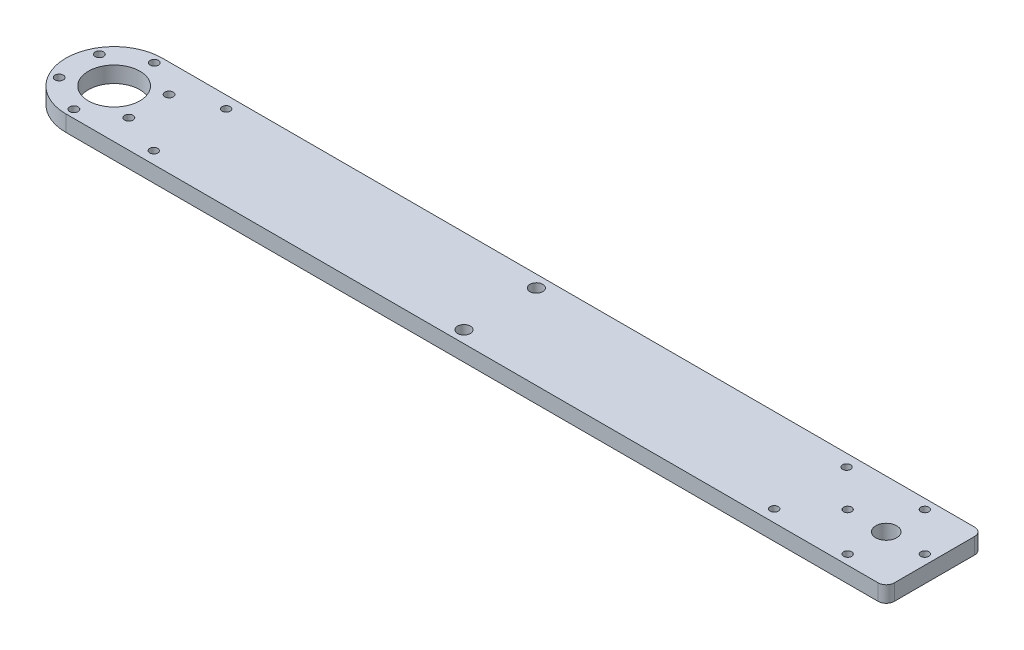
ISO-10303-21;
HEADER;
FILE_DESCRIPTION(('STEP AP214'),'2;1');
FILE_NAME('part.step','',(''),(''),'','','');
FILE_SCHEMA(('AUTOMOTIVE_DESIGN { 1 0 10303 214 1 1 1 1 }'));
ENDSEC;
DATA;
#1=APPLICATION_CONTEXT('core data for automotive mechanical design processes');
#2=APPLICATION_PROTOCOL_DEFINITION('international standard','automotive_design',2000,#1);
#3=PRODUCT_CONTEXT('',#1,'mechanical');
#4=PRODUCT('Part','Part','',(#3));
#5=PRODUCT_RELATED_PRODUCT_CATEGORY('part','',(#4));
#6=PRODUCT_DEFINITION_FORMATION('','',#4);
#7=PRODUCT_DEFINITION_CONTEXT('part definition',#1,'design');
#8=PRODUCT_DEFINITION('design','',#6,#7);
#9=PRODUCT_DEFINITION_SHAPE('','',#8);
#10=(LENGTH_UNIT() NAMED_UNIT(*) SI_UNIT(.MILLI.,.METRE.));
#11=(NAMED_UNIT(*) PLANE_ANGLE_UNIT() SI_UNIT($,.RADIAN.));
#12=(NAMED_UNIT(*) SI_UNIT($,.STERADIAN.) SOLID_ANGLE_UNIT());
#13=UNCERTAINTY_MEASURE_WITH_UNIT(LENGTH_MEASURE(1.E-05),#10,'distance_accuracy_value','');
#14=(GEOMETRIC_REPRESENTATION_CONTEXT(3) GLOBAL_UNCERTAINTY_ASSIGNED_CONTEXT((#13)) GLOBAL_UNIT_ASSIGNED_CONTEXT((#10,
#11,#12)) REPRESENTATION_CONTEXT('',''));
#15=CARTESIAN_POINT('',(0.,0.,0.));
#16=DIRECTION('',(0.,0.,1.));
#17=DIRECTION('',(1.,0.,0.));
#18=AXIS2_PLACEMENT_3D('',#15,#16,#17);
#19=CARTESIAN_POINT('',(-250.,5.,0.));
#20=DIRECTION('',(0.,-1.,0.));
#21=DIRECTION('',(0.,0.,-1.));
#22=AXIS2_PLACEMENT_3D('',#19,#20,#21);
#23=CYLINDRICAL_SURFACE('',#22,30.);
#24=CARTESIAN_POINT('',(-250.,-5.,0.));
#25=DIRECTION('',(0.,1.,0.));
#26=DIRECTION('',(0.,0.,1.));
#27=AXIS2_PLACEMENT_3D('',#24,#25,#26);
#28=CIRCLE('',#27,30.);
#29=CARTESIAN_POINT('',(-250.,-5.,-30.));
#30=VERTEX_POINT('',#29);
#31=CARTESIAN_POINT('',(-250.,-5.,30.));
#32=VERTEX_POINT('',#31);
#33=EDGE_CURVE('E123',#30,#32,#28,.T.);
#34=ORIENTED_EDGE('',*,*,#33,.T.);
#35=DIRECTION('',(0.,-1.,0.));
#36=VECTOR('',#35,1.);
#37=CARTESIAN_POINT('',(-250.,5.,30.));
#38=LINE('',#37,#36);
#39=CARTESIAN_POINT('',(-250.,5.,30.));
#40=VERTEX_POINT('',#39);
#41=EDGE_CURVE('E104',#40,#32,#38,.T.);
#42=ORIENTED_EDGE('',*,*,#41,.F.);
#43=CARTESIAN_POINT('',(-250.,5.,0.));
#44=DIRECTION('',(0.,1.,0.));
#45=DIRECTION('',(0.,0.,1.));
#46=AXIS2_PLACEMENT_3D('',#43,#44,#45);
#47=CIRCLE('',#46,30.);
#48=CARTESIAN_POINT('',(-250.,5.,-30.));
#49=VERTEX_POINT('',#48);
#50=EDGE_CURVE('E111',#49,#40,#47,.T.);
#51=ORIENTED_EDGE('',*,*,#50,.F.);
#52=DIRECTION('',(0.,-1.,0.));
#53=VECTOR('',#52,1.);
#54=CARTESIAN_POINT('',(-250.,5.,-30.));
#55=LINE('',#54,#53);
#56=EDGE_CURVE('E125',#49,#30,#55,.T.);
#57=ORIENTED_EDGE('',*,*,#56,.T.);
#58=EDGE_LOOP('',(#34,#42,#51,#57));
#59=FACE_BOUND('',#58,.T.);
#60=ADVANCED_FACE('F43',(#59),#23,.T.);
#61=CARTESIAN_POINT('',(280.,5.,29.9999999999999));
#62=DIRECTION('',(0.,0.,-1.));
#63=DIRECTION('',(-1.,0.,0.));
#64=AXIS2_PLACEMENT_3D('',#61,#62,#63);
#65=PLANE('',#64);
#66=DIRECTION('',(1.,0.,0.));
#67=VECTOR('',#66,1.);
#68=CARTESIAN_POINT('',(280.,-5.,29.9999999999999));
#69=LINE('',#68,#67);
#70=CARTESIAN_POINT('',(255.,-5.,29.9999999999999));
#71=VERTEX_POINT('',#70);
#72=EDGE_CURVE('E152',#32,#71,#69,.T.);
#73=ORIENTED_EDGE('',*,*,#72,.T.);
#74=DIRECTION('',(0.,1.,0.));
#75=VECTOR('',#74,1.);
#76=CARTESIAN_POINT('',(255.,5.,29.9999999999999));
#77=LINE('',#76,#75);
#78=CARTESIAN_POINT('',(255.,5.,29.9999999999999));
#79=VERTEX_POINT('',#78);
#80=EDGE_CURVE('E107',#71,#79,#77,.T.);
#81=ORIENTED_EDGE('',*,*,#80,.T.);
#82=DIRECTION('',(1.,0.,0.));
#83=VECTOR('',#82,1.);
#84=CARTESIAN_POINT('',(-250.,5.,30.));
#85=LINE('',#84,#83);
#86=EDGE_CURVE('E99',#40,#79,#85,.T.);
#87=ORIENTED_EDGE('',*,*,#86,.F.);
#88=ORIENTED_EDGE('',*,*,#41,.T.);
#89=EDGE_LOOP('',(#73,#81,#87,#88));
#90=FACE_BOUND('',#89,.T.);
#91=ADVANCED_FACE('F102',(#90),#65,.F.);
#92=CARTESIAN_POINT('',(-250.,5.,-30.));
#93=DIRECTION('',(0.,0.,1.));
#94=DIRECTION('',(1.,0.,0.));
#95=AXIS2_PLACEMENT_3D('',#92,#93,#94);
#96=PLANE('',#95);
#97=DIRECTION('',(-1.,0.,0.));
#98=VECTOR('',#97,1.);
#99=CARTESIAN_POINT('',(280.,5.,-30.0000000000001));
#100=LINE('',#99,#98);
#101=CARTESIAN_POINT('',(255.,5.,-30.0000000000001));
#102=VERTEX_POINT('',#101);
#103=EDGE_CURVE('E110',#102,#49,#100,.T.);
#104=ORIENTED_EDGE('',*,*,#103,.F.);
#105=DIRECTION('',(0.,1.,0.));
#106=VECTOR('',#105,1.);
#107=CARTESIAN_POINT('',(255.,5.,-30.0000000000001));
#108=LINE('',#107,#106);
#109=CARTESIAN_POINT('',(255.,-5.,-30.0000000000001));
#110=VERTEX_POINT('',#109);
#111=EDGE_CURVE('E11',#102,#110,#108,.F.);
#112=ORIENTED_EDGE('',*,*,#111,.T.);
#113=DIRECTION('',(-1.,0.,0.));
#114=VECTOR('',#113,1.);
#115=CARTESIAN_POINT('',(-250.,-5.,-30.));
#116=LINE('',#115,#114);
#117=EDGE_CURVE('E120',#110,#30,#116,.T.);
#118=ORIENTED_EDGE('',*,*,#117,.T.);
#119=ORIENTED_EDGE('',*,*,#56,.F.);
#120=EDGE_LOOP('',(#104,#112,#118,#119));
#121=FACE_BOUND('',#120,.T.);
#122=ADVANCED_FACE('F233',(#121),#96,.F.);
#123=CARTESIAN_POINT('',(-250.,5.,0.));
#124=DIRECTION('',(0.,1.,0.));
#125=DIRECTION('',(0.,0.,1.));
#126=AXIS2_PLACEMENT_3D('',#123,#124,#125);
#127=PLANE('',#126);
#128=CARTESIAN_POINT('',(254.,5.,0.));
#129=DIRECTION('',(0.,1.,0.));
#130=DIRECTION('',(-1.,0.,0.));
#131=AXIS2_PLACEMENT_3D('',#128,#129,#130);
#132=CIRCLE('',#131,2.5);
#133=CARTESIAN_POINT('',(251.5,5.,0.));
#134=VERTEX_POINT('',#133);
#135=EDGE_CURVE('E349',#134,#134,#132,.T.);
#136=ORIENTED_EDGE('',*,*,#135,.F.);
#137=EDGE_LOOP('',(#136));
#138=FACE_BOUND('',#137,.T.);
#139=CARTESIAN_POINT('',(230.,5.,24.));
#140=DIRECTION('',(0.,1.,0.));
#141=DIRECTION('',(0.,0.,-1.));
#142=AXIS2_PLACEMENT_3D('',#139,#140,#141);
#143=CIRCLE('',#142,2.5);
#144=CARTESIAN_POINT('',(230.,5.,21.5));
#145=VERTEX_POINT('',#144);
#146=EDGE_CURVE('E357',#145,#145,#143,.T.);
#147=ORIENTED_EDGE('',*,*,#146,.F.);
#148=EDGE_LOOP('',(#147));
#149=FACE_BOUND('',#148,.T.);
#150=CARTESIAN_POINT('',(206.,5.,-2.4980018054066E-13));
#151=DIRECTION('',(0.,1.,0.));
#152=DIRECTION('',(1.,0.,0.));
#153=AXIS2_PLACEMENT_3D('',#150,#151,#152);
#154=CIRCLE('',#153,2.5);
#155=CARTESIAN_POINT('',(208.5,5.,-2.23614070499337E-13));
#156=VERTEX_POINT('',#155);
#157=EDGE_CURVE('E341',#156,#156,#154,.T.);
#158=ORIENTED_EDGE('',*,*,#157,.F.);
#159=EDGE_LOOP('',(#158));
#160=FACE_BOUND('',#159,.T.);
#161=CARTESIAN_POINT('',(230.,5.,-24.));
#162=DIRECTION('',(0.,1.,0.));
#163=DIRECTION('',(0.,0.,1.));
#164=AXIS2_PLACEMENT_3D('',#161,#162,#163);
#165=CIRCLE('',#164,2.5);
#166=CARTESIAN_POINT('',(230.,5.,-21.5));
#167=VERTEX_POINT('',#166);
#168=EDGE_CURVE('E348',#167,#167,#165,.T.);
#169=ORIENTED_EDGE('',*,*,#168,.F.);
#170=EDGE_LOOP('',(#169));
#171=FACE_BOUND('',#170,.T.);
#172=CARTESIAN_POINT('',(-10.,5.,-22.5));
#173=DIRECTION('',(0.,1.,0.));
#174=DIRECTION('',(0.,0.,1.));
#175=AXIS2_PLACEMENT_3D('',#172,#173,#174);
#176=CIRCLE('',#175,4.);
#177=CARTESIAN_POINT('',(-10.,5.,-18.5));
#178=VERTEX_POINT('',#177);
#179=EDGE_CURVE('E376',#178,#178,#176,.T.);
#180=ORIENTED_EDGE('',*,*,#179,.F.);
#181=EDGE_LOOP('',(#180));
#182=FACE_BOUND('',#181,.T.);
#183=CARTESIAN_POINT('',(-10.,5.,22.5));
#184=DIRECTION('',(0.,-1.,0.));
#185=DIRECTION('',(0.,0.,-1.));
#186=AXIS2_PLACEMENT_3D('',#183,#184,#185);
#187=CIRCLE('',#186,4.);
#188=CARTESIAN_POINT('',(-10.,5.,18.5));
#189=VERTEX_POINT('',#188);
#190=EDGE_CURVE('E384',#189,#189,#187,.T.);
#191=ORIENTED_EDGE('',*,*,#190,.T.);
#192=EDGE_LOOP('',(#191));
#193=FACE_BOUND('',#192,.T.);
#194=CARTESIAN_POINT('',(-202.85,5.,-22.5));
#195=DIRECTION('',(0.,-1.,0.));
#196=DIRECTION('',(0.,0.,-1.));
#197=AXIS2_PLACEMENT_3D('',#194,#195,#196);
#198=CIRCLE('',#197,2.5);
#199=CARTESIAN_POINT('',(-202.85,5.,-25.));
#200=VERTEX_POINT('',#199);
#201=EDGE_CURVE('E392',#200,#200,#198,.T.);
#202=ORIENTED_EDGE('',*,*,#201,.T.);
#203=EDGE_LOOP('',(#202));
#204=FACE_BOUND('',#203,.T.);
#205=CARTESIAN_POINT('',(-202.85,5.,22.5));
#206=DIRECTION('',(0.,-1.,0.));
#207=DIRECTION('',(0.,0.,-1.));
#208=AXIS2_PLACEMENT_3D('',#205,#206,#207);
#209=CIRCLE('',#208,2.5);
#210=CARTESIAN_POINT('',(-202.85,5.,20.));
#211=VERTEX_POINT('',#210);
#212=EDGE_CURVE('E388',#211,#211,#209,.T.);
#213=ORIENTED_EDGE('',*,*,#212,.T.);
#214=EDGE_LOOP('',(#213));
#215=FACE_BOUND('',#214,.T.);
#216=CARTESIAN_POINT('',(182.85,5.,-22.5));
#217=DIRECTION('',(0.,-1.,0.));
#218=DIRECTION('',(0.,0.,-1.));
#219=AXIS2_PLACEMENT_3D('',#216,#217,#218);
#220=CIRCLE('',#219,2.5);
#221=CARTESIAN_POINT('',(182.85,5.,-25.));
#222=VERTEX_POINT('',#221);
#223=EDGE_CURVE('E163',#222,#222,#220,.T.);
#224=ORIENTED_EDGE('',*,*,#223,.T.);
#225=EDGE_LOOP('',(#224));
#226=FACE_BOUND('',#225,.T.);
#227=CARTESIAN_POINT('',(182.85,5.,22.5));
#228=DIRECTION('',(0.,-1.,0.));
#229=DIRECTION('',(0.,0.,-1.));
#230=AXIS2_PLACEMENT_3D('',#227,#228,#229);
#231=CIRCLE('',#230,2.5);
#232=CARTESIAN_POINT('',(182.85,5.,20.));
#233=VERTEX_POINT('',#232);
#234=EDGE_CURVE('E396',#233,#233,#231,.T.);
#235=ORIENTED_EDGE('',*,*,#234,.T.);
#236=EDGE_LOOP('',(#235));
#237=FACE_BOUND('',#236,.T.);
#238=ORIENTED_EDGE('',*,*,#86,.T.);
#239=CARTESIAN_POINT('',(255.,5.,24.9999999999999));
#240=DIRECTION('',(0.,1.,0.));
#241=DIRECTION('',(0.,0.,1.));
#242=AXIS2_PLACEMENT_3D('',#239,#240,#241);
#243=CIRCLE('',#242,5.);
#244=CARTESIAN_POINT('',(260.,5.,24.9999999999999));
#245=VERTEX_POINT('',#244);
#246=EDGE_CURVE('E136',#79,#245,#243,.T.);
#247=ORIENTED_EDGE('',*,*,#246,.T.);
#248=DIRECTION('',(0.,0.,1.));
#249=VECTOR('',#248,1.);
#250=CARTESIAN_POINT('',(260.,5.,-30.));
#251=LINE('',#250,#249);
#252=CARTESIAN_POINT('',(260.,5.,-25.0000000000001));
#253=VERTEX_POINT('',#252);
#254=EDGE_CURVE('E159',#253,#245,#251,.T.);
#255=ORIENTED_EDGE('',*,*,#254,.F.);
#256=CARTESIAN_POINT('',(255.,5.,-25.0000000000001));
#257=DIRECTION('',(0.,1.,0.));
#258=DIRECTION('',(0.,0.,1.));
#259=AXIS2_PLACEMENT_3D('',#256,#257,#258);
#260=CIRCLE('',#259,5.);
#261=EDGE_CURVE('E129',#253,#102,#260,.T.);
#262=ORIENTED_EDGE('',*,*,#261,.T.);
#263=ORIENTED_EDGE('',*,*,#103,.T.);
#264=ORIENTED_EDGE('',*,*,#50,.T.);
#265=EDGE_LOOP('',(#238,#247,#255,#262,#263,#264));
#266=FACE_BOUND('',#265,.T.);
#267=CARTESIAN_POINT('',(-228.349364905389,5.,-12.5000000000003));
#268=DIRECTION('',(0.,1.,0.));
#269=DIRECTION('',(-0.866025403784433,0.,0.50000000000001));
#270=AXIS2_PLACEMENT_3D('',#267,#268,#269);
#271=CIRCLE('',#270,2.59999999999999);
#272=CARTESIAN_POINT('',(-230.601030955229,5.,-11.2000000000002));
#273=VERTEX_POINT('',#272);
#274=EDGE_CURVE('E167',#273,#273,#271,.T.);
#275=ORIENTED_EDGE('',*,*,#274,.F.);
#276=EDGE_LOOP('',(#275));
#277=FACE_BOUND('',#276,.T.);
#278=CARTESIAN_POINT('',(-228.349364905389,5.,12.4999999999998));
#279=DIRECTION('',(0.,1.,0.));
#280=DIRECTION('',(-0.866025403784443,0.,-0.499999999999992));
#281=AXIS2_PLACEMENT_3D('',#278,#279,#280);
#282=CIRCLE('',#281,2.59999999999999);
#283=CARTESIAN_POINT('',(-230.601030955228,5.,11.1999999999998));
#284=VERTEX_POINT('',#283);
#285=EDGE_CURVE('E195',#284,#284,#282,.T.);
#286=ORIENTED_EDGE('',*,*,#285,.F.);
#287=EDGE_LOOP('',(#286));
#288=FACE_BOUND('',#287,.T.);
#289=CARTESIAN_POINT('',(-250.,5.,25.));
#290=DIRECTION('',(0.,1.,0.));
#291=DIRECTION('',(0.,0.,-1.));
#292=AXIS2_PLACEMENT_3D('',#289,#290,#291);
#293=CIRCLE('',#292,2.59999999999999);
#294=CARTESIAN_POINT('',(-250.,5.,22.4));
#295=VERTEX_POINT('',#294);
#296=EDGE_CURVE('E187',#295,#295,#293,.T.);
#297=ORIENTED_EDGE('',*,*,#296,.F.);
#298=EDGE_LOOP('',(#297));
#299=FACE_BOUND('',#298,.T.);
#300=CARTESIAN_POINT('',(-271.650635094611,5.,12.5000000000001));
#301=DIRECTION('',(0.,1.,0.));
#302=DIRECTION('',(0.866025403784436,0.,-0.500000000000004));
#303=AXIS2_PLACEMENT_3D('',#300,#301,#302);
#304=CIRCLE('',#303,2.59999999999999);
#305=CARTESIAN_POINT('',(-269.398969044771,5.,11.2000000000001));
#306=VERTEX_POINT('',#305);
#307=EDGE_CURVE('E179',#306,#306,#304,.T.);
#308=ORIENTED_EDGE('',*,*,#307,.F.);
#309=EDGE_LOOP('',(#308));
#310=FACE_BOUND('',#309,.T.);
#311=CARTESIAN_POINT('',(-271.650635094611,5.,-12.5));
#312=DIRECTION('',(0.,1.,0.));
#313=DIRECTION('',(0.86602540378444,0.,0.499999999999998));
#314=AXIS2_PLACEMENT_3D('',#311,#312,#313);
#315=CIRCLE('',#314,2.59999999999999);
#316=CARTESIAN_POINT('',(-269.398969044771,5.,-11.2));
#317=VERTEX_POINT('',#316);
#318=EDGE_CURVE('E178',#317,#317,#315,.T.);
#319=ORIENTED_EDGE('',*,*,#318,.F.);
#320=EDGE_LOOP('',(#319));
#321=FACE_BOUND('',#320,.T.);
#322=CARTESIAN_POINT('',(-250.,5.,-25.));
#323=DIRECTION('',(0.,1.,0.));
#324=DIRECTION('',(0.,0.,1.));
#325=AXIS2_PLACEMENT_3D('',#322,#323,#324);
#326=CIRCLE('',#325,2.59999999999999);
#327=CARTESIAN_POINT('',(-250.,5.,-22.4));
#328=VERTEX_POINT('',#327);
#329=EDGE_CURVE('E210',#328,#328,#326,.T.);
#330=ORIENTED_EDGE('',*,*,#329,.F.);
#331=EDGE_LOOP('',(#330));
#332=FACE_BOUND('',#331,.T.);
#333=CARTESIAN_POINT('',(-250.,5.,0.));
#334=DIRECTION('',(0.,1.,0.));
#335=DIRECTION('',(0.,0.,1.));
#336=AXIS2_PLACEMENT_3D('',#333,#334,#335);
#337=CIRCLE('',#336,16.);
#338=CARTESIAN_POINT('',(-250.,5.,16.));
#339=VERTEX_POINT('',#338);
#340=EDGE_CURVE('E218',#339,#339,#337,.T.);
#341=ORIENTED_EDGE('',*,*,#340,.F.);
#342=EDGE_LOOP('',(#341));
#343=FACE_BOUND('',#342,.T.);
#344=CARTESIAN_POINT('',(230.,5.,0.));
#345=DIRECTION('',(0.,1.,0.));
#346=DIRECTION('',(0.,0.,1.));
#347=AXIS2_PLACEMENT_3D('',#344,#345,#346);
#348=CIRCLE('',#347,6.50000000000002);
#349=CARTESIAN_POINT('',(230.,5.,6.50000000000002));
#350=VERTEX_POINT('',#349);
#351=EDGE_CURVE('E336',#350,#350,#348,.T.);
#352=ORIENTED_EDGE('',*,*,#351,.F.);
#353=EDGE_LOOP('',(#352));
#354=FACE_BOUND('',#353,.T.);
#355=ADVANCED_FACE('F114',(#138,#149,#160,#171,#182,#193,#204,#215,#226,#237,#266,#277,#288,
#299,#310,#321,#332,#343,#354),#127,.T.);
#356=CARTESIAN_POINT('',(-250.,-5.,0.));
#357=DIRECTION('',(0.,1.,0.));
#358=DIRECTION('',(0.,0.,1.));
#359=AXIS2_PLACEMENT_3D('',#356,#357,#358);
#360=PLANE('',#359);
#361=CARTESIAN_POINT('',(254.,-5.,0.));
#362=DIRECTION('',(0.,1.,0.));
#363=DIRECTION('',(-1.,0.,0.));
#364=AXIS2_PLACEMENT_3D('',#361,#362,#363);
#365=CIRCLE('',#364,2.5);
#366=CARTESIAN_POINT('',(251.5,-5.,0.));
#367=VERTEX_POINT('',#366);
#368=EDGE_CURVE('E344',#367,#367,#365,.T.);
#369=ORIENTED_EDGE('',*,*,#368,.T.);
#370=EDGE_LOOP('',(#369));
#371=FACE_BOUND('',#370,.T.);
#372=CARTESIAN_POINT('',(230.,-5.,24.));
#373=DIRECTION('',(0.,1.,0.));
#374=DIRECTION('',(0.,0.,-1.));
#375=AXIS2_PLACEMENT_3D('',#372,#373,#374);
#376=CIRCLE('',#375,2.5);
#377=CARTESIAN_POINT('',(230.,-5.,21.5));
#378=VERTEX_POINT('',#377);
#379=EDGE_CURVE('E353',#378,#378,#376,.T.);
#380=ORIENTED_EDGE('',*,*,#379,.T.);
#381=EDGE_LOOP('',(#380));
#382=FACE_BOUND('',#381,.T.);
#383=CARTESIAN_POINT('',(206.,-5.,-2.4980018054066E-13));
#384=DIRECTION('',(0.,1.,0.));
#385=DIRECTION('',(1.,0.,0.));
#386=AXIS2_PLACEMENT_3D('',#383,#384,#385);
#387=CIRCLE('',#386,2.5);
#388=CARTESIAN_POINT('',(208.5,-5.,-2.23614070499337E-13));
#389=VERTEX_POINT('',#388);
#390=EDGE_CURVE('E361',#389,#389,#387,.T.);
#391=ORIENTED_EDGE('',*,*,#390,.T.);
#392=EDGE_LOOP('',(#391));
#393=FACE_BOUND('',#392,.T.);
#394=CARTESIAN_POINT('',(230.,-5.,-24.));
#395=DIRECTION('',(0.,1.,0.));
#396=DIRECTION('',(0.,0.,1.));
#397=AXIS2_PLACEMENT_3D('',#394,#395,#396);
#398=CIRCLE('',#397,2.5);
#399=CARTESIAN_POINT('',(230.,-5.,-21.5));
#400=VERTEX_POINT('',#399);
#401=EDGE_CURVE('E368',#400,#400,#398,.T.);
#402=ORIENTED_EDGE('',*,*,#401,.T.);
#403=EDGE_LOOP('',(#402));
#404=FACE_BOUND('',#403,.T.);
#405=CARTESIAN_POINT('',(-10.,-5.,-22.5));
#406=DIRECTION('',(0.,1.,0.));
#407=DIRECTION('',(0.,0.,1.));
#408=AXIS2_PLACEMENT_3D('',#405,#406,#407);
#409=CIRCLE('',#408,4.);
#410=CARTESIAN_POINT('',(-10.,-5.,-18.5));
#411=VERTEX_POINT('',#410);
#412=EDGE_CURVE('E372',#411,#411,#409,.T.);
#413=ORIENTED_EDGE('',*,*,#412,.T.);
#414=EDGE_LOOP('',(#413));
#415=FACE_BOUND('',#414,.T.);
#416=CARTESIAN_POINT('',(-10.,-5.,22.5));
#417=DIRECTION('',(0.,-1.,0.));
#418=DIRECTION('',(0.,0.,-1.));
#419=AXIS2_PLACEMENT_3D('',#416,#417,#418);
#420=CIRCLE('',#419,4.);
#421=CARTESIAN_POINT('',(-10.,-5.,18.5));
#422=VERTEX_POINT('',#421);
#423=EDGE_CURVE('E380',#422,#422,#420,.T.);
#424=ORIENTED_EDGE('',*,*,#423,.F.);
#425=EDGE_LOOP('',(#424));
#426=FACE_BOUND('',#425,.T.);
#427=CARTESIAN_POINT('',(-202.85,-5.,-22.5));
#428=DIRECTION('',(0.,-1.,0.));
#429=DIRECTION('',(0.,0.,-1.));
#430=AXIS2_PLACEMENT_3D('',#427,#428,#429);
#431=CIRCLE('',#430,2.5);
#432=CARTESIAN_POINT('',(-202.85,-5.,-25.));
#433=VERTEX_POINT('',#432);
#434=EDGE_CURVE('E397',#433,#433,#431,.T.);
#435=ORIENTED_EDGE('',*,*,#434,.F.);
#436=EDGE_LOOP('',(#435));
#437=FACE_BOUND('',#436,.T.);
#438=CARTESIAN_POINT('',(-202.85,-5.,22.5));
#439=DIRECTION('',(0.,-1.,0.));
#440=DIRECTION('',(0.,0.,-1.));
#441=AXIS2_PLACEMENT_3D('',#438,#439,#440);
#442=CIRCLE('',#441,2.5);
#443=CARTESIAN_POINT('',(-202.85,-5.,20.));
#444=VERTEX_POINT('',#443);
#445=EDGE_CURVE('E401',#444,#444,#442,.T.);
#446=ORIENTED_EDGE('',*,*,#445,.F.);
#447=EDGE_LOOP('',(#446));
#448=FACE_BOUND('',#447,.T.);
#449=CARTESIAN_POINT('',(182.85,-5.,-22.5));
#450=DIRECTION('',(0.,-1.,0.));
#451=DIRECTION('',(0.,0.,-1.));
#452=AXIS2_PLACEMENT_3D('',#449,#450,#451);
#453=CIRCLE('',#452,2.5);
#454=CARTESIAN_POINT('',(182.85,-5.,-25.));
#455=VERTEX_POINT('',#454);
#456=EDGE_CURVE('E170',#455,#455,#453,.T.);
#457=ORIENTED_EDGE('',*,*,#456,.F.);
#458=EDGE_LOOP('',(#457));
#459=FACE_BOUND('',#458,.T.);
#460=CARTESIAN_POINT('',(182.85,-5.,22.5));
#461=DIRECTION('',(0.,-1.,0.));
#462=DIRECTION('',(0.,0.,-1.));
#463=AXIS2_PLACEMENT_3D('',#460,#461,#462);
#464=CIRCLE('',#463,2.5);
#465=CARTESIAN_POINT('',(182.85,-5.,20.));
#466=VERTEX_POINT('',#465);
#467=EDGE_CURVE('E411',#466,#466,#464,.T.);
#468=ORIENTED_EDGE('',*,*,#467,.F.);
#469=EDGE_LOOP('',(#468));
#470=FACE_BOUND('',#469,.T.);
#471=CARTESIAN_POINT('',(-228.349364905389,-5.,-12.5000000000003));
#472=DIRECTION('',(0.,1.,0.));
#473=DIRECTION('',(-0.866025403784433,0.,0.50000000000001));
#474=AXIS2_PLACEMENT_3D('',#471,#472,#473);
#475=CIRCLE('',#474,2.59999999999999);
#476=CARTESIAN_POINT('',(-230.601030955229,-5.,-11.2000000000002));
#477=VERTEX_POINT('',#476);
#478=EDGE_CURVE('E199',#477,#477,#475,.T.);
#479=ORIENTED_EDGE('',*,*,#478,.T.);
#480=EDGE_LOOP('',(#479));
#481=FACE_BOUND('',#480,.T.);
#482=CARTESIAN_POINT('',(-228.349364905389,-5.,12.4999999999998));
#483=DIRECTION('',(0.,1.,0.));
#484=DIRECTION('',(-0.866025403784443,0.,-0.499999999999992));
#485=AXIS2_PLACEMENT_3D('',#482,#483,#484);
#486=CIRCLE('',#485,2.59999999999999);
#487=CARTESIAN_POINT('',(-230.601030955228,-5.,11.1999999999998));
#488=VERTEX_POINT('',#487);
#489=EDGE_CURVE('E191',#488,#488,#486,.T.);
#490=ORIENTED_EDGE('',*,*,#489,.T.);
#491=EDGE_LOOP('',(#490));
#492=FACE_BOUND('',#491,.T.);
#493=CARTESIAN_POINT('',(-250.,-5.,25.));
#494=DIRECTION('',(0.,1.,0.));
#495=DIRECTION('',(0.,0.,-1.));
#496=AXIS2_PLACEMENT_3D('',#493,#494,#495);
#497=CIRCLE('',#496,2.59999999999999);
#498=CARTESIAN_POINT('',(-250.,-5.,22.4));
#499=VERTEX_POINT('',#498);
#500=EDGE_CURVE('E183',#499,#499,#497,.T.);
#501=ORIENTED_EDGE('',*,*,#500,.T.);
#502=EDGE_LOOP('',(#501));
#503=FACE_BOUND('',#502,.T.);
#504=CARTESIAN_POINT('',(-271.650635094611,-5.,12.5000000000001));
#505=DIRECTION('',(0.,1.,0.));
#506=DIRECTION('',(0.866025403784436,0.,-0.500000000000004));
#507=AXIS2_PLACEMENT_3D('',#504,#505,#506);
#508=CIRCLE('',#507,2.59999999999999);
#509=CARTESIAN_POINT('',(-269.398969044771,-5.,11.2000000000001));
#510=VERTEX_POINT('',#509);
#511=EDGE_CURVE('E174',#510,#510,#508,.T.);
#512=ORIENTED_EDGE('',*,*,#511,.T.);
#513=EDGE_LOOP('',(#512));
#514=FACE_BOUND('',#513,.T.);
#515=CARTESIAN_POINT('',(-271.650635094611,-5.,-12.5));
#516=DIRECTION('',(0.,1.,0.));
#517=DIRECTION('',(0.86602540378444,0.,0.499999999999998));
#518=AXIS2_PLACEMENT_3D('',#515,#516,#517);
#519=CIRCLE('',#518,2.59999999999999);
#520=CARTESIAN_POINT('',(-269.398969044771,-5.,-11.2));
#521=VERTEX_POINT('',#520);
#522=EDGE_CURVE('E206',#521,#521,#519,.T.);
#523=ORIENTED_EDGE('',*,*,#522,.T.);
#524=EDGE_LOOP('',(#523));
#525=FACE_BOUND('',#524,.T.);
#526=CARTESIAN_POINT('',(-250.,-5.,-25.));
#527=DIRECTION('',(0.,1.,0.));
#528=DIRECTION('',(0.,0.,1.));
#529=AXIS2_PLACEMENT_3D('',#526,#527,#528);
#530=CIRCLE('',#529,2.59999999999999);
#531=CARTESIAN_POINT('',(-250.,-5.,-22.4));
#532=VERTEX_POINT('',#531);
#533=EDGE_CURVE('E214',#532,#532,#530,.T.);
#534=ORIENTED_EDGE('',*,*,#533,.T.);
#535=EDGE_LOOP('',(#534));
#536=FACE_BOUND('',#535,.T.);
#537=CARTESIAN_POINT('',(-250.,-5.,0.));
#538=DIRECTION('',(0.,1.,0.));
#539=DIRECTION('',(0.,0.,1.));
#540=AXIS2_PLACEMENT_3D('',#537,#538,#539);
#541=CIRCLE('',#540,16.);
#542=CARTESIAN_POINT('',(-250.,-5.,16.));
#543=VERTEX_POINT('',#542);
#544=EDGE_CURVE('E222',#543,#543,#541,.T.);
#545=ORIENTED_EDGE('',*,*,#544,.T.);
#546=EDGE_LOOP('',(#545));
#547=FACE_BOUND('',#546,.T.);
#548=DIRECTION('',(0.,0.,1.));
#549=VECTOR('',#548,1.);
#550=CARTESIAN_POINT('',(260.,-5.,-30.));
#551=LINE('',#550,#549);
#552=CARTESIAN_POINT('',(260.,-5.,-25.0000000000001));
#553=VERTEX_POINT('',#552);
#554=CARTESIAN_POINT('',(260.,-5.,24.9999999999999));
#555=VERTEX_POINT('',#554);
#556=EDGE_CURVE('E153',#553,#555,#551,.T.);
#557=ORIENTED_EDGE('',*,*,#556,.T.);
#558=CARTESIAN_POINT('',(255.,-5.,24.9999999999999));
#559=DIRECTION('',(0.,1.,0.));
#560=DIRECTION('',(0.,0.,1.));
#561=AXIS2_PLACEMENT_3D('',#558,#559,#560);
#562=CIRCLE('',#561,5.);
#563=EDGE_CURVE('E52',#555,#71,#562,.F.);
#564=ORIENTED_EDGE('',*,*,#563,.T.);
#565=ORIENTED_EDGE('',*,*,#72,.F.);
#566=ORIENTED_EDGE('',*,*,#33,.F.);
#567=ORIENTED_EDGE('',*,*,#117,.F.);
#568=CARTESIAN_POINT('',(255.,-5.,-25.0000000000001));
#569=DIRECTION('',(0.,1.,0.));
#570=DIRECTION('',(0.,0.,1.));
#571=AXIS2_PLACEMENT_3D('',#568,#569,#570);
#572=CIRCLE('',#571,5.);
#573=EDGE_CURVE('E145',#110,#553,#572,.F.);
#574=ORIENTED_EDGE('',*,*,#573,.T.);
#575=EDGE_LOOP('',(#557,#564,#565,#566,#567,#574));
#576=FACE_BOUND('',#575,.T.);
#577=CARTESIAN_POINT('',(230.,-5.,0.));
#578=DIRECTION('',(0.,1.,0.));
#579=DIRECTION('',(0.,0.,1.));
#580=AXIS2_PLACEMENT_3D('',#577,#578,#579);
#581=CIRCLE('',#580,6.50000000000002);
#582=CARTESIAN_POINT('',(230.,-5.,6.50000000000002));
#583=VERTEX_POINT('',#582);
#584=EDGE_CURVE('E333',#583,#583,#581,.T.);
#585=ORIENTED_EDGE('',*,*,#584,.T.);
#586=EDGE_LOOP('',(#585));
#587=FACE_BOUND('',#586,.T.);
#588=ADVANCED_FACE('F150',(#371,#382,#393,#404,#415,#426,#437,#448,#459,#470,#481,#492,#503,
#514,#525,#536,#547,#576,#587),#360,.F.);
#589=CARTESIAN_POINT('',(-250.,-5.,0.));
#590=DIRECTION('',(0.,1.,0.));
#591=DIRECTION('',(0.,0.,1.));
#592=AXIS2_PLACEMENT_3D('',#589,#590,#591);
#593=CYLINDRICAL_SURFACE('',#592,16.);
#594=ORIENTED_EDGE('',*,*,#544,.F.);
#595=EDGE_LOOP('',(#594));
#596=FACE_BOUND('',#595,.T.);
#597=ORIENTED_EDGE('',*,*,#340,.T.);
#598=EDGE_LOOP('',(#597));
#599=FACE_BOUND('',#598,.T.);
#600=ADVANCED_FACE('F256',(#596,#599),#593,.F.);
#601=CARTESIAN_POINT('',(-250.,-5.,-25.));
#602=DIRECTION('',(0.,1.,0.));
#603=DIRECTION('',(0.,0.,1.));
#604=AXIS2_PLACEMENT_3D('',#601,#602,#603);
#605=CYLINDRICAL_SURFACE('',#604,2.59999999999999);
#606=ORIENTED_EDGE('',*,*,#533,.F.);
#607=EDGE_LOOP('',(#606));
#608=FACE_BOUND('',#607,.T.);
#609=ORIENTED_EDGE('',*,*,#329,.T.);
#610=EDGE_LOOP('',(#609));
#611=FACE_BOUND('',#610,.T.);
#612=ADVANCED_FACE('F263',(#608,#611),#605,.F.);
#613=CARTESIAN_POINT('',(-271.650635094611,-5.,-12.5));
#614=DIRECTION('',(0.,1.,0.));
#615=DIRECTION('',(0.,0.,1.));
#616=AXIS2_PLACEMENT_3D('',#613,#614,#615);
#617=CYLINDRICAL_SURFACE('',#616,2.59999999999999);
#618=ORIENTED_EDGE('',*,*,#522,.F.);
#619=EDGE_LOOP('',(#618));
#620=FACE_BOUND('',#619,.T.);
#621=ORIENTED_EDGE('',*,*,#318,.T.);
#622=EDGE_LOOP('',(#621));
#623=FACE_BOUND('',#622,.T.);
#624=ADVANCED_FACE('F267',(#620,#623),#617,.F.);
#625=CARTESIAN_POINT('',(-271.650635094611,-5.,12.5000000000001));
#626=DIRECTION('',(0.,1.,0.));
#627=DIRECTION('',(0.,0.,1.));
#628=AXIS2_PLACEMENT_3D('',#625,#626,#627);
#629=CYLINDRICAL_SURFACE('',#628,2.59999999999999);
#630=ORIENTED_EDGE('',*,*,#511,.F.);
#631=EDGE_LOOP('',(#630));
#632=FACE_BOUND('',#631,.T.);
#633=ORIENTED_EDGE('',*,*,#307,.T.);
#634=EDGE_LOOP('',(#633));
#635=FACE_BOUND('',#634,.T.);
#636=ADVANCED_FACE('F271',(#632,#635),#629,.F.);
#637=CARTESIAN_POINT('',(-250.,-5.,25.));
#638=DIRECTION('',(0.,1.,0.));
#639=DIRECTION('',(0.,0.,1.));
#640=AXIS2_PLACEMENT_3D('',#637,#638,#639);
#641=CYLINDRICAL_SURFACE('',#640,2.59999999999999);
#642=ORIENTED_EDGE('',*,*,#500,.F.);
#643=EDGE_LOOP('',(#642));
#644=FACE_BOUND('',#643,.T.);
#645=ORIENTED_EDGE('',*,*,#296,.T.);
#646=EDGE_LOOP('',(#645));
#647=FACE_BOUND('',#646,.T.);
#648=ADVANCED_FACE('F280',(#644,#647),#641,.F.);
#649=CARTESIAN_POINT('',(-228.349364905389,-5.,12.4999999999998));
#650=DIRECTION('',(0.,1.,0.));
#651=DIRECTION('',(0.,0.,1.));
#652=AXIS2_PLACEMENT_3D('',#649,#650,#651);
#653=CYLINDRICAL_SURFACE('',#652,2.59999999999999);
#654=ORIENTED_EDGE('',*,*,#489,.F.);
#655=EDGE_LOOP('',(#654));
#656=FACE_BOUND('',#655,.T.);
#657=ORIENTED_EDGE('',*,*,#285,.T.);
#658=EDGE_LOOP('',(#657));
#659=FACE_BOUND('',#658,.T.);
#660=ADVANCED_FACE('F276',(#656,#659),#653,.F.);
#661=CARTESIAN_POINT('',(-228.349364905389,-5.,-12.5000000000003));
#662=DIRECTION('',(0.,1.,0.));
#663=DIRECTION('',(0.,0.,1.));
#664=AXIS2_PLACEMENT_3D('',#661,#662,#663);
#665=CYLINDRICAL_SURFACE('',#664,2.59999999999999);
#666=ORIENTED_EDGE('',*,*,#478,.F.);
#667=EDGE_LOOP('',(#666));
#668=FACE_BOUND('',#667,.T.);
#669=ORIENTED_EDGE('',*,*,#274,.T.);
#670=EDGE_LOOP('',(#669));
#671=FACE_BOUND('',#670,.T.);
#672=ADVANCED_FACE('F273',(#668,#671),#665,.F.);
#673=CARTESIAN_POINT('',(260.,-5.,-30.));
#674=DIRECTION('',(-1.,0.,0.));
#675=DIRECTION('',(0.,0.,1.));
#676=AXIS2_PLACEMENT_3D('',#673,#674,#675);
#677=PLANE('',#676);
#678=ORIENTED_EDGE('',*,*,#254,.T.);
#679=DIRECTION('',(0.,1.,0.));
#680=VECTOR('',#679,1.);
#681=CARTESIAN_POINT('',(260.,-5.,24.9999999999999));
#682=LINE('',#681,#680);
#683=EDGE_CURVE('E65',#245,#555,#682,.F.);
#684=ORIENTED_EDGE('',*,*,#683,.T.);
#685=ORIENTED_EDGE('',*,*,#556,.F.);
#686=DIRECTION('',(0.,1.,0.));
#687=VECTOR('',#686,1.);
#688=CARTESIAN_POINT('',(260.,-5.,-25.0000000000001));
#689=LINE('',#688,#687);
#690=EDGE_CURVE('E139',#553,#253,#689,.T.);
#691=ORIENTED_EDGE('',*,*,#690,.T.);
#692=EDGE_LOOP('',(#678,#684,#685,#691));
#693=FACE_BOUND('',#692,.T.);
#694=ADVANCED_FACE('F160',(#693),#677,.F.);
#695=CARTESIAN_POINT('',(255.,5.,24.9999999999999));
#696=DIRECTION('',(0.,1.,0.));
#697=DIRECTION('',(0.,0.,1.));
#698=AXIS2_PLACEMENT_3D('',#695,#696,#697);
#699=CYLINDRICAL_SURFACE('',#698,5.);
#700=ORIENTED_EDGE('',*,*,#563,.F.);
#701=ORIENTED_EDGE('',*,*,#683,.F.);
#702=ORIENTED_EDGE('',*,*,#246,.F.);
#703=ORIENTED_EDGE('',*,*,#80,.F.);
#704=EDGE_LOOP('',(#700,#701,#702,#703));
#705=FACE_BOUND('',#704,.T.);
#706=ADVANCED_FACE('F157',(#705),#699,.T.);
#707=CARTESIAN_POINT('',(255.,-5.,-25.0000000000001));
#708=DIRECTION('',(0.,1.,0.));
#709=DIRECTION('',(0.,0.,1.));
#710=AXIS2_PLACEMENT_3D('',#707,#708,#709);
#711=CYLINDRICAL_SURFACE('',#710,5.);
#712=ORIENTED_EDGE('',*,*,#573,.F.);
#713=ORIENTED_EDGE('',*,*,#111,.F.);
#714=ORIENTED_EDGE('',*,*,#261,.F.);
#715=ORIENTED_EDGE('',*,*,#690,.F.);
#716=EDGE_LOOP('',(#712,#713,#714,#715));
#717=FACE_BOUND('',#716,.T.);
#718=ADVANCED_FACE('F45',(#717),#711,.T.);
#719=CARTESIAN_POINT('',(182.85,5.,22.5));
#720=DIRECTION('',(0.,-1.,0.));
#721=DIRECTION('',(0.,0.,-1.));
#722=AXIS2_PLACEMENT_3D('',#719,#720,#721);
#723=CYLINDRICAL_SURFACE('',#722,2.5);
#724=ORIENTED_EDGE('',*,*,#234,.F.);
#725=EDGE_LOOP('',(#724));
#726=FACE_BOUND('',#725,.T.);
#727=ORIENTED_EDGE('',*,*,#467,.T.);
#728=EDGE_LOOP('',(#727));
#729=FACE_BOUND('',#728,.T.);
#730=ADVANCED_FACE('F237',(#726,#729),#723,.F.);
#731=CARTESIAN_POINT('',(182.85,5.,-22.5));
#732=DIRECTION('',(0.,-1.,0.));
#733=DIRECTION('',(0.,0.,-1.));
#734=AXIS2_PLACEMENT_3D('',#731,#732,#733);
#735=CYLINDRICAL_SURFACE('',#734,2.5);
#736=ORIENTED_EDGE('',*,*,#223,.F.);
#737=EDGE_LOOP('',(#736));
#738=FACE_BOUND('',#737,.T.);
#739=ORIENTED_EDGE('',*,*,#456,.T.);
#740=EDGE_LOOP('',(#739));
#741=FACE_BOUND('',#740,.T.);
#742=ADVANCED_FACE('F242',(#738,#741),#735,.F.);
#743=CARTESIAN_POINT('',(-202.85,5.,22.5));
#744=DIRECTION('',(0.,-1.,0.));
#745=DIRECTION('',(0.,0.,-1.));
#746=AXIS2_PLACEMENT_3D('',#743,#744,#745);
#747=CYLINDRICAL_SURFACE('',#746,2.5);
#748=ORIENTED_EDGE('',*,*,#212,.F.);
#749=EDGE_LOOP('',(#748));
#750=FACE_BOUND('',#749,.T.);
#751=ORIENTED_EDGE('',*,*,#445,.T.);
#752=EDGE_LOOP('',(#751));
#753=FACE_BOUND('',#752,.T.);
#754=ADVANCED_FACE('F292',(#750,#753),#747,.F.);
#755=CARTESIAN_POINT('',(-202.85,5.,-22.5));
#756=DIRECTION('',(0.,-1.,0.));
#757=DIRECTION('',(0.,0.,-1.));
#758=AXIS2_PLACEMENT_3D('',#755,#756,#757);
#759=CYLINDRICAL_SURFACE('',#758,2.5);
#760=ORIENTED_EDGE('',*,*,#201,.F.);
#761=EDGE_LOOP('',(#760));
#762=FACE_BOUND('',#761,.T.);
#763=ORIENTED_EDGE('',*,*,#434,.T.);
#764=EDGE_LOOP('',(#763));
#765=FACE_BOUND('',#764,.T.);
#766=ADVANCED_FACE('F296',(#762,#765),#759,.F.);
#767=CARTESIAN_POINT('',(-10.,5.,22.5));
#768=DIRECTION('',(0.,-1.,0.));
#769=DIRECTION('',(0.,0.,-1.));
#770=AXIS2_PLACEMENT_3D('',#767,#768,#769);
#771=CYLINDRICAL_SURFACE('',#770,4.);
#772=ORIENTED_EDGE('',*,*,#190,.F.);
#773=EDGE_LOOP('',(#772));
#774=FACE_BOUND('',#773,.T.);
#775=ORIENTED_EDGE('',*,*,#423,.T.);
#776=EDGE_LOOP('',(#775));
#777=FACE_BOUND('',#776,.T.);
#778=ADVANCED_FACE('F300',(#774,#777),#771,.F.);
#779=CARTESIAN_POINT('',(-10.,5.,-22.5));
#780=DIRECTION('',(0.,-1.,0.));
#781=DIRECTION('',(0.,0.,-1.));
#782=AXIS2_PLACEMENT_3D('',#779,#780,#781);
#783=CYLINDRICAL_SURFACE('',#782,4.);
#784=ORIENTED_EDGE('',*,*,#179,.T.);
#785=EDGE_LOOP('',(#784));
#786=FACE_BOUND('',#785,.T.);
#787=ORIENTED_EDGE('',*,*,#412,.F.);
#788=EDGE_LOOP('',(#787));
#789=FACE_BOUND('',#788,.T.);
#790=ADVANCED_FACE('F304',(#786,#789),#783,.F.);
#791=CARTESIAN_POINT('',(230.,-5.,-24.));
#792=DIRECTION('',(0.,1.,0.));
#793=DIRECTION('',(0.,0.,1.));
#794=AXIS2_PLACEMENT_3D('',#791,#792,#793);
#795=CYLINDRICAL_SURFACE('',#794,2.5);
#796=ORIENTED_EDGE('',*,*,#401,.F.);
#797=EDGE_LOOP('',(#796));
#798=FACE_BOUND('',#797,.T.);
#799=ORIENTED_EDGE('',*,*,#168,.T.);
#800=EDGE_LOOP('',(#799));
#801=FACE_BOUND('',#800,.T.);
#802=ADVANCED_FACE('F308',(#798,#801),#795,.F.);
#803=CARTESIAN_POINT('',(206.,-5.,-2.4980018054066E-13));
#804=DIRECTION('',(0.,1.,0.));
#805=DIRECTION('',(0.,0.,1.));
#806=AXIS2_PLACEMENT_3D('',#803,#804,#805);
#807=CYLINDRICAL_SURFACE('',#806,2.5);
#808=ORIENTED_EDGE('',*,*,#390,.F.);
#809=EDGE_LOOP('',(#808));
#810=FACE_BOUND('',#809,.T.);
#811=ORIENTED_EDGE('',*,*,#157,.T.);
#812=EDGE_LOOP('',(#811));
#813=FACE_BOUND('',#812,.T.);
#814=ADVANCED_FACE('F312',(#810,#813),#807,.F.);
#815=CARTESIAN_POINT('',(230.,-5.,24.));
#816=DIRECTION('',(0.,1.,0.));
#817=DIRECTION('',(0.,0.,1.));
#818=AXIS2_PLACEMENT_3D('',#815,#816,#817);
#819=CYLINDRICAL_SURFACE('',#818,2.5);
#820=ORIENTED_EDGE('',*,*,#379,.F.);
#821=EDGE_LOOP('',(#820));
#822=FACE_BOUND('',#821,.T.);
#823=ORIENTED_EDGE('',*,*,#146,.T.);
#824=EDGE_LOOP('',(#823));
#825=FACE_BOUND('',#824,.T.);
#826=ADVANCED_FACE('F316',(#822,#825),#819,.F.);
#827=CARTESIAN_POINT('',(254.,-5.,0.));
#828=DIRECTION('',(0.,1.,0.));
#829=DIRECTION('',(0.,0.,1.));
#830=AXIS2_PLACEMENT_3D('',#827,#828,#829);
#831=CYLINDRICAL_SURFACE('',#830,2.5);
#832=ORIENTED_EDGE('',*,*,#368,.F.);
#833=EDGE_LOOP('',(#832));
#834=FACE_BOUND('',#833,.T.);
#835=ORIENTED_EDGE('',*,*,#135,.T.);
#836=EDGE_LOOP('',(#835));
#837=FACE_BOUND('',#836,.T.);
#838=ADVANCED_FACE('F320',(#834,#837),#831,.F.);
#839=CARTESIAN_POINT('',(230.,-5.,0.));
#840=DIRECTION('',(0.,1.,0.));
#841=DIRECTION('',(0.,0.,1.));
#842=AXIS2_PLACEMENT_3D('',#839,#840,#841);
#843=CYLINDRICAL_SURFACE('',#842,6.50000000000002);
#844=ORIENTED_EDGE('',*,*,#584,.F.);
#845=EDGE_LOOP('',(#844));
#846=FACE_BOUND('',#845,.T.);
#847=ORIENTED_EDGE('',*,*,#351,.T.);
#848=EDGE_LOOP('',(#847));
#849=FACE_BOUND('',#848,.T.);
#850=ADVANCED_FACE('F324',(#846,#849),#843,.F.);
#851=CLOSED_SHELL('',(#60,#91,#122,#355,#588,#600,#612,#624,#636,#648,#660,#672,#694,#706,#718,
#730,#742,#754,#766,#778,#790,#802,#814,#826,#838,#850));
#852=MANIFOLD_SOLID_BREP('B2',#851);
#853=ADVANCED_BREP_SHAPE_REPRESENTATION('',(#18,#852),#14);
#854=SHAPE_DEFINITION_REPRESENTATION(#9,#853);
ENDSEC;
END-ISO-10303-21;
